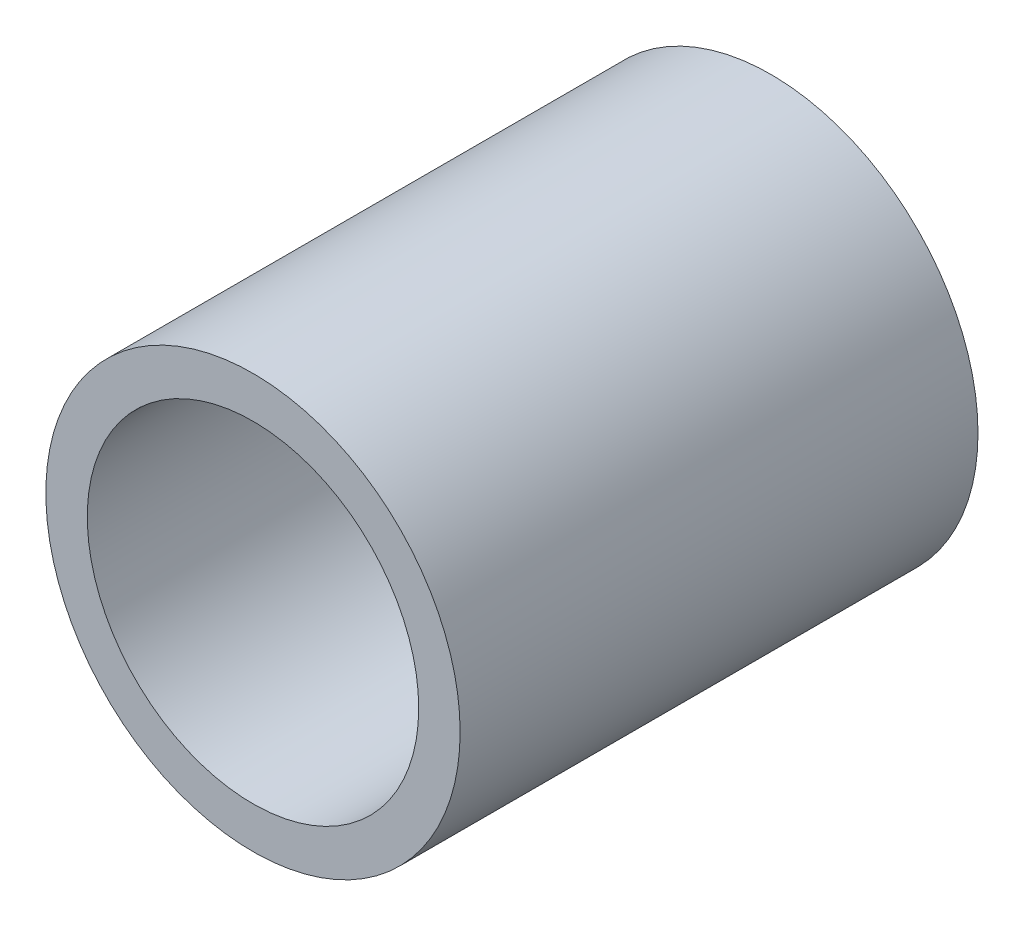
ISO-10303-21;
HEADER;
FILE_DESCRIPTION(('STEP AP214'),'2;1');
FILE_NAME('part.step','',(''),(''),'','','');
FILE_SCHEMA(('AUTOMOTIVE_DESIGN { 1 0 10303 214 1 1 1 1 }'));
ENDSEC;
DATA;
#1=APPLICATION_CONTEXT('core data for automotive mechanical design processes');
#2=APPLICATION_PROTOCOL_DEFINITION('international standard','automotive_design',2000,#1);
#3=PRODUCT_CONTEXT('',#1,'mechanical');
#4=PRODUCT('Part','Part','',(#3));
#5=PRODUCT_RELATED_PRODUCT_CATEGORY('part','',(#4));
#6=PRODUCT_DEFINITION_FORMATION('','',#4);
#7=PRODUCT_DEFINITION_CONTEXT('part definition',#1,'design');
#8=PRODUCT_DEFINITION('design','',#6,#7);
#9=PRODUCT_DEFINITION_SHAPE('','',#8);
#10=(LENGTH_UNIT() NAMED_UNIT(*) SI_UNIT(.MILLI.,.METRE.));
#11=(NAMED_UNIT(*) PLANE_ANGLE_UNIT() SI_UNIT($,.RADIAN.));
#12=(NAMED_UNIT(*) SI_UNIT($,.STERADIAN.) SOLID_ANGLE_UNIT());
#13=UNCERTAINTY_MEASURE_WITH_UNIT(LENGTH_MEASURE(1.E-05),#10,'distance_accuracy_value','');
#14=(GEOMETRIC_REPRESENTATION_CONTEXT(3) GLOBAL_UNCERTAINTY_ASSIGNED_CONTEXT((#13)) GLOBAL_UNIT_ASSIGNED_CONTEXT((#10,
#11,#12)) REPRESENTATION_CONTEXT('',''));
#15=CARTESIAN_POINT('',(0.,0.,0.));
#16=DIRECTION('',(0.,0.,1.));
#17=DIRECTION('',(1.,0.,0.));
#18=AXIS2_PLACEMENT_3D('',#15,#16,#17);
#19=CARTESIAN_POINT('',(0.,0.,5.));
#20=DIRECTION('',(0.,0.,1.));
#21=DIRECTION('',(1.,0.,0.));
#22=AXIS2_PLACEMENT_3D('',#19,#20,#21);
#23=PLANE('',#22);
#24=CARTESIAN_POINT('',(0.,0.,5.));
#25=DIRECTION('',(0.,0.,1.));
#26=DIRECTION('',(1.,0.,0.));
#27=AXIS2_PLACEMENT_3D('',#24,#25,#26);
#28=CIRCLE('',#27,2.);
#29=CARTESIAN_POINT('',(2.,0.,5.));
#30=VERTEX_POINT('',#29);
#31=EDGE_CURVE('E10',#30,#30,#28,.T.);
#32=ORIENTED_EDGE('',*,*,#31,.T.);
#33=EDGE_LOOP('',(#32));
#34=FACE_BOUND('',#33,.T.);
#35=CARTESIAN_POINT('',(0.,0.,5.));
#36=DIRECTION('',(0.,0.,1.));
#37=DIRECTION('',(1.,0.,0.));
#38=AXIS2_PLACEMENT_3D('',#35,#36,#37);
#39=CIRCLE('',#38,1.6);
#40=CARTESIAN_POINT('',(1.6,0.,5.));
#41=VERTEX_POINT('',#40);
#42=EDGE_CURVE('E42',#41,#41,#39,.T.);
#43=ORIENTED_EDGE('',*,*,#42,.F.);
#44=EDGE_LOOP('',(#43));
#45=FACE_BOUND('',#44,.T.);
#46=ADVANCED_FACE('F31',(#34,#45),#23,.T.);
#47=CARTESIAN_POINT('',(0.,0.,0.));
#48=DIRECTION('',(0.,0.,1.));
#49=DIRECTION('',(1.,0.,0.));
#50=AXIS2_PLACEMENT_3D('',#47,#48,#49);
#51=PLANE('',#50);
#52=CARTESIAN_POINT('',(0.,0.,0.));
#53=DIRECTION('',(0.,0.,1.));
#54=DIRECTION('',(1.,0.,0.));
#55=AXIS2_PLACEMENT_3D('',#52,#53,#54);
#56=CIRCLE('',#55,2.);
#57=CARTESIAN_POINT('',(2.,0.,0.));
#58=VERTEX_POINT('',#57);
#59=EDGE_CURVE('E35',#58,#58,#56,.T.);
#60=ORIENTED_EDGE('',*,*,#59,.F.);
#61=EDGE_LOOP('',(#60));
#62=FACE_BOUND('',#61,.T.);
#63=CARTESIAN_POINT('',(0.,0.,0.));
#64=DIRECTION('',(0.,0.,1.));
#65=DIRECTION('',(1.,0.,0.));
#66=AXIS2_PLACEMENT_3D('',#63,#64,#65);
#67=CIRCLE('',#66,1.6);
#68=CARTESIAN_POINT('',(1.6,0.,0.));
#69=VERTEX_POINT('',#68);
#70=EDGE_CURVE('E44',#69,#69,#67,.T.);
#71=ORIENTED_EDGE('',*,*,#70,.T.);
#72=EDGE_LOOP('',(#71));
#73=FACE_BOUND('',#72,.T.);
#74=ADVANCED_FACE('F54',(#62,#73),#51,.F.);
#75=CARTESIAN_POINT('',(0.,0.,5.));
#76=DIRECTION('',(0.,0.,-1.));
#77=DIRECTION('',(-1.,0.,0.));
#78=AXIS2_PLACEMENT_3D('',#75,#76,#77);
#79=CYLINDRICAL_SURFACE('',#78,2.);
#80=ORIENTED_EDGE('',*,*,#31,.F.);
#81=EDGE_LOOP('',(#80));
#82=FACE_BOUND('',#81,.T.);
#83=ORIENTED_EDGE('',*,*,#59,.T.);
#84=EDGE_LOOP('',(#83));
#85=FACE_BOUND('',#84,.T.);
#86=ADVANCED_FACE('F33',(#82,#85),#79,.T.);
#87=CARTESIAN_POINT('',(0.,0.,5.));
#88=DIRECTION('',(0.,0.,-1.));
#89=DIRECTION('',(-1.,0.,0.));
#90=AXIS2_PLACEMENT_3D('',#87,#88,#89);
#91=CYLINDRICAL_SURFACE('',#90,1.6);
#92=ORIENTED_EDGE('',*,*,#42,.T.);
#93=EDGE_LOOP('',(#92));
#94=FACE_BOUND('',#93,.T.);
#95=ORIENTED_EDGE('',*,*,#70,.F.);
#96=EDGE_LOOP('',(#95));
#97=FACE_BOUND('',#96,.T.);
#98=ADVANCED_FACE('F50',(#94,#97),#91,.F.);
#99=CLOSED_SHELL('',(#46,#74,#86,#98));
#100=MANIFOLD_SOLID_BREP('B2',#99);
#101=ADVANCED_BREP_SHAPE_REPRESENTATION('',(#18,#100),#14);
#102=SHAPE_DEFINITION_REPRESENTATION(#9,#101);
ENDSEC;
END-ISO-10303-21;
